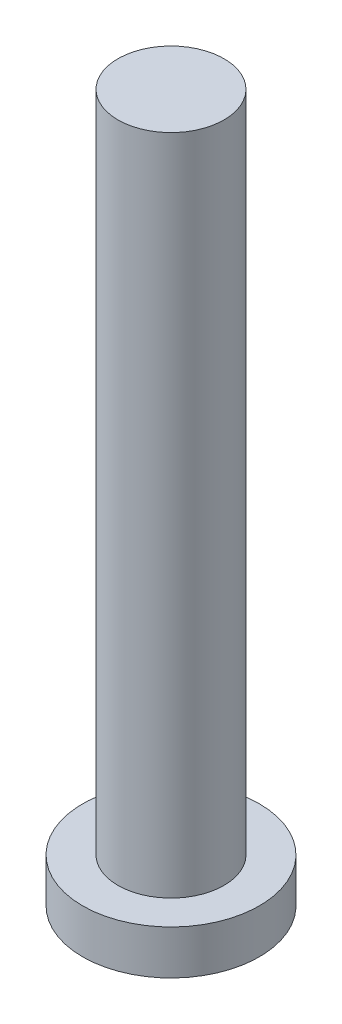
ISO-10303-21;
HEADER;
FILE_DESCRIPTION(('STEP AP214'),'2;1');
FILE_NAME('part.step','',(''),(''),'','','');
FILE_SCHEMA(('AUTOMOTIVE_DESIGN { 1 0 10303 214 1 1 1 1 }'));
ENDSEC;
DATA;
#1=APPLICATION_CONTEXT('core data for automotive mechanical design processes');
#2=APPLICATION_PROTOCOL_DEFINITION('international standard','automotive_design',2000,#1);
#3=PRODUCT_CONTEXT('',#1,'mechanical');
#4=PRODUCT('Part','Part','',(#3));
#5=PRODUCT_RELATED_PRODUCT_CATEGORY('part','',(#4));
#6=PRODUCT_DEFINITION_FORMATION('','',#4);
#7=PRODUCT_DEFINITION_CONTEXT('part definition',#1,'design');
#8=PRODUCT_DEFINITION('design','',#6,#7);
#9=PRODUCT_DEFINITION_SHAPE('','',#8);
#10=(LENGTH_UNIT() NAMED_UNIT(*) SI_UNIT(.MILLI.,.METRE.));
#11=(NAMED_UNIT(*) PLANE_ANGLE_UNIT() SI_UNIT($,.RADIAN.));
#12=(NAMED_UNIT(*) SI_UNIT($,.STERADIAN.) SOLID_ANGLE_UNIT());
#13=UNCERTAINTY_MEASURE_WITH_UNIT(LENGTH_MEASURE(1.E-05),#10,'distance_accuracy_value','');
#14=(GEOMETRIC_REPRESENTATION_CONTEXT(3) GLOBAL_UNCERTAINTY_ASSIGNED_CONTEXT((#13)) GLOBAL_UNIT_ASSIGNED_CONTEXT((#10,
#11,#12)) REPRESENTATION_CONTEXT('',''));
#15=CARTESIAN_POINT('',(0.,0.,0.));
#16=DIRECTION('',(0.,0.,1.));
#17=DIRECTION('',(1.,0.,0.));
#18=AXIS2_PLACEMENT_3D('',#15,#16,#17);
#19=CARTESIAN_POINT('',(0.,1.,0.));
#20=DIRECTION('',(0.,-1.,0.));
#21=DIRECTION('',(0.,0.,-1.));
#22=AXIS2_PLACEMENT_3D('',#19,#20,#21);
#23=CYLINDRICAL_SURFACE('',#22,2.);
#24=CARTESIAN_POINT('',(0.,1.,0.));
#25=DIRECTION('',(0.,1.,0.));
#26=DIRECTION('',(0.,0.,1.));
#27=AXIS2_PLACEMENT_3D('',#24,#25,#26);
#28=CIRCLE('',#27,2.);
#29=CARTESIAN_POINT('',(0.,1.,2.));
#30=VERTEX_POINT('',#29);
#31=EDGE_CURVE('E49',#30,#30,#28,.T.);
#32=ORIENTED_EDGE('',*,*,#31,.F.);
#33=EDGE_LOOP('',(#32));
#34=FACE_BOUND('',#33,.T.);
#35=CARTESIAN_POINT('',(0.,0.,0.));
#36=DIRECTION('',(0.,1.,0.));
#37=DIRECTION('',(0.,0.,1.));
#38=AXIS2_PLACEMENT_3D('',#35,#36,#37);
#39=CIRCLE('',#38,2.);
#40=CARTESIAN_POINT('',(0.,0.,2.));
#41=VERTEX_POINT('',#40);
#42=EDGE_CURVE('E44',#41,#41,#39,.T.);
#43=ORIENTED_EDGE('',*,*,#42,.T.);
#44=EDGE_LOOP('',(#43));
#45=FACE_BOUND('',#44,.T.);
#46=ADVANCED_FACE('F41',(#34,#45),#23,.T.);
#47=CARTESIAN_POINT('',(0.,1.,0.));
#48=DIRECTION('',(0.,1.,0.));
#49=DIRECTION('',(0.,0.,1.));
#50=AXIS2_PLACEMENT_3D('',#47,#48,#49);
#51=PLANE('',#50);
#52=CARTESIAN_POINT('',(0.,1.,0.));
#53=DIRECTION('',(0.,1.,0.));
#54=DIRECTION('',(0.,0.,1.));
#55=AXIS2_PLACEMENT_3D('',#52,#53,#54);
#56=CIRCLE('',#55,1.2);
#57=CARTESIAN_POINT('',(0.,1.,1.2));
#58=VERTEX_POINT('',#57);
#59=EDGE_CURVE('E10',#58,#58,#56,.T.);
#60=ORIENTED_EDGE('',*,*,#59,.F.);
#61=EDGE_LOOP('',(#60));
#62=FACE_BOUND('',#61,.T.);
#63=ORIENTED_EDGE('',*,*,#31,.T.);
#64=EDGE_LOOP('',(#63));
#65=FACE_BOUND('',#64,.T.);
#66=ADVANCED_FACE('F69',(#62,#65),#51,.T.);
#67=CARTESIAN_POINT('',(0.,0.,0.));
#68=DIRECTION('',(0.,1.,0.));
#69=DIRECTION('',(0.,0.,1.));
#70=AXIS2_PLACEMENT_3D('',#67,#68,#69);
#71=PLANE('',#70);
#72=ORIENTED_EDGE('',*,*,#42,.F.);
#73=EDGE_LOOP('',(#72));
#74=FACE_BOUND('',#73,.T.);
#75=ADVANCED_FACE('F66',(#74),#71,.F.);
#76=CARTESIAN_POINT('',(0.,16.,0.));
#77=DIRECTION('',(0.,-1.,0.));
#78=DIRECTION('',(0.,0.,-1.));
#79=AXIS2_PLACEMENT_3D('',#76,#77,#78);
#80=CYLINDRICAL_SURFACE('',#79,1.2);
#81=CARTESIAN_POINT('',(0.,16.,0.));
#82=DIRECTION('',(0.,1.,0.));
#83=DIRECTION('',(0.,0.,1.));
#84=AXIS2_PLACEMENT_3D('',#81,#82,#83);
#85=CIRCLE('',#84,1.2);
#86=CARTESIAN_POINT('',(0.,16.,1.2));
#87=VERTEX_POINT('',#86);
#88=EDGE_CURVE('E56',#87,#87,#85,.T.);
#89=ORIENTED_EDGE('',*,*,#88,.F.);
#90=EDGE_LOOP('',(#89));
#91=FACE_BOUND('',#90,.T.);
#92=ORIENTED_EDGE('',*,*,#59,.T.);
#93=EDGE_LOOP('',(#92));
#94=FACE_BOUND('',#93,.T.);
#95=ADVANCED_FACE('F68',(#91,#94),#80,.T.);
#96=CARTESIAN_POINT('',(0.,16.,0.));
#97=DIRECTION('',(0.,1.,0.));
#98=DIRECTION('',(0.,0.,1.));
#99=AXIS2_PLACEMENT_3D('',#96,#97,#98);
#100=PLANE('',#99);
#101=ORIENTED_EDGE('',*,*,#88,.T.);
#102=EDGE_LOOP('',(#101));
#103=FACE_BOUND('',#102,.T.);
#104=ADVANCED_FACE('F74',(#103),#100,.T.);
#105=CLOSED_SHELL('',(#46,#66,#75,#95,#104));
#106=MANIFOLD_SOLID_BREP('B2',#105);
#107=ADVANCED_BREP_SHAPE_REPRESENTATION('',(#18,#106),#14);
#108=SHAPE_DEFINITION_REPRESENTATION(#9,#107);
ENDSEC;
END-ISO-10303-21;
